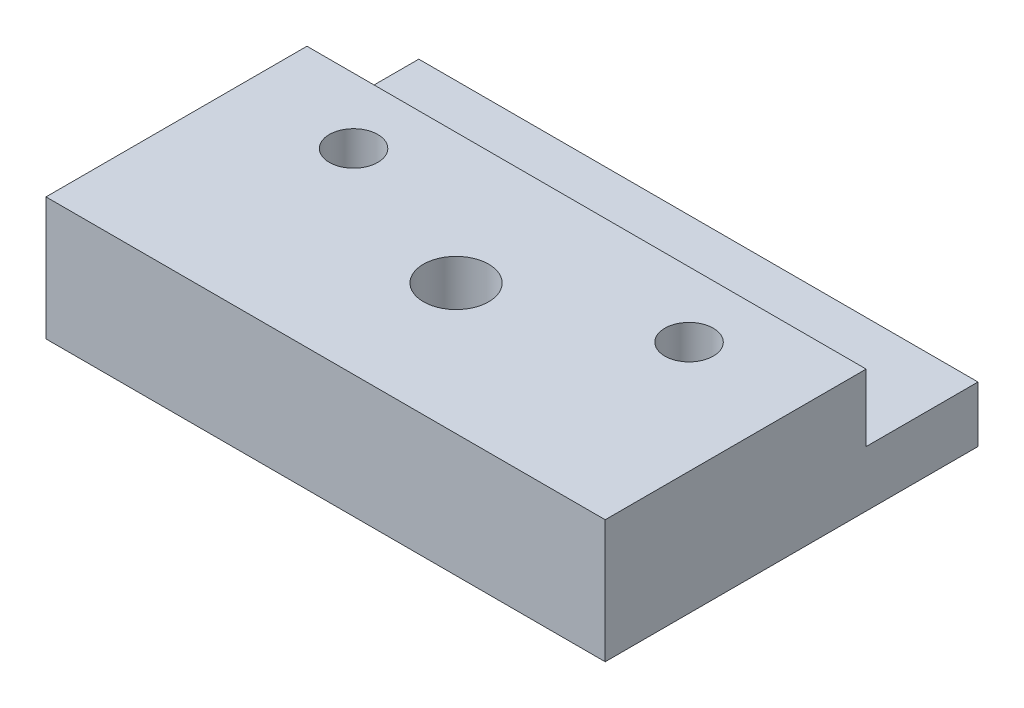
ISO-10303-21;
HEADER;
FILE_DESCRIPTION(('STEP AP214'),'2;1');
FILE_NAME('part.step','',(''),(''),'','','');
FILE_SCHEMA(('AUTOMOTIVE_DESIGN { 1 0 10303 214 1 1 1 1 }'));
ENDSEC;
DATA;
#1=APPLICATION_CONTEXT('core data for automotive mechanical design processes');
#2=APPLICATION_PROTOCOL_DEFINITION('international standard','automotive_design',2000,#1);
#3=PRODUCT_CONTEXT('',#1,'mechanical');
#4=PRODUCT('Part','Part','',(#3));
#5=PRODUCT_RELATED_PRODUCT_CATEGORY('part','',(#4));
#6=PRODUCT_DEFINITION_FORMATION('','',#4);
#7=PRODUCT_DEFINITION_CONTEXT('part definition',#1,'design');
#8=PRODUCT_DEFINITION('design','',#6,#7);
#9=PRODUCT_DEFINITION_SHAPE('','',#8);
#10=(LENGTH_UNIT() NAMED_UNIT(*) SI_UNIT(.MILLI.,.METRE.));
#11=(NAMED_UNIT(*) PLANE_ANGLE_UNIT() SI_UNIT($,.RADIAN.));
#12=(NAMED_UNIT(*) SI_UNIT($,.STERADIAN.) SOLID_ANGLE_UNIT());
#13=UNCERTAINTY_MEASURE_WITH_UNIT(LENGTH_MEASURE(1.E-05),#10,'distance_accuracy_value','');
#14=(GEOMETRIC_REPRESENTATION_CONTEXT(3) GLOBAL_UNCERTAINTY_ASSIGNED_CONTEXT((#13)) GLOBAL_UNIT_ASSIGNED_CONTEXT((#10,
#11,#12)) REPRESENTATION_CONTEXT('',''));
#15=CARTESIAN_POINT('',(0.,0.,0.));
#16=DIRECTION('',(0.,0.,1.));
#17=DIRECTION('',(1.,0.,0.));
#18=AXIS2_PLACEMENT_3D('',#15,#16,#17);
#19=CARTESIAN_POINT('',(0.,3.,0.));
#20=DIRECTION('',(0.,-1.,0.));
#21=DIRECTION('',(0.,0.,-1.));
#22=AXIS2_PLACEMENT_3D('',#19,#20,#21);
#23=PLANE('',#22);
#24=DIRECTION('',(-1.,0.,0.));
#25=VECTOR('',#24,1.);
#26=CARTESIAN_POINT('',(0.,3.,-14.));
#27=LINE('',#26,#25);
#28=CARTESIAN_POINT('',(30.,3.,-14.));
#29=VERTEX_POINT('',#28);
#30=CARTESIAN_POINT('',(0.,3.,-14.));
#31=VERTEX_POINT('',#30);
#32=EDGE_CURVE('E52',#29,#31,#27,.T.);
#33=ORIENTED_EDGE('',*,*,#32,.F.);
#34=DIRECTION('',(0.,0.,-1.));
#35=VECTOR('',#34,1.);
#36=CARTESIAN_POINT('',(30.,3.,0.));
#37=LINE('',#36,#35);
#38=CARTESIAN_POINT('',(30.,3.,-20.));
#39=VERTEX_POINT('',#38);
#40=EDGE_CURVE('E112',#29,#39,#37,.T.);
#41=ORIENTED_EDGE('',*,*,#40,.T.);
#42=DIRECTION('',(-1.,0.,0.));
#43=VECTOR('',#42,1.);
#44=CARTESIAN_POINT('',(0.,3.,-20.));
#45=LINE('',#44,#43);
#46=CARTESIAN_POINT('',(0.,3.,-20.));
#47=VERTEX_POINT('',#46);
#48=EDGE_CURVE('E58',#39,#47,#45,.T.);
#49=ORIENTED_EDGE('',*,*,#48,.T.);
#50=DIRECTION('',(0.,0.,1.));
#51=VECTOR('',#50,1.);
#52=CARTESIAN_POINT('',(0.,3.,0.));
#53=LINE('',#52,#51);
#54=EDGE_CURVE('E87',#47,#31,#53,.T.);
#55=ORIENTED_EDGE('',*,*,#54,.T.);
#56=EDGE_LOOP('',(#33,#41,#49,#55));
#57=FACE_BOUND('',#56,.T.);
#58=ADVANCED_FACE('F35',(#57),#23,.F.);
#59=CARTESIAN_POINT('',(0.,3.,0.));
#60=DIRECTION('',(1.,0.,0.));
#61=DIRECTION('',(0.,0.,-1.));
#62=AXIS2_PLACEMENT_3D('',#59,#60,#61);
#63=PLANE('',#62);
#64=DIRECTION('',(0.,0.,1.));
#65=VECTOR('',#64,1.);
#66=CARTESIAN_POINT('',(0.,0.,0.));
#67=LINE('',#66,#65);
#68=CARTESIAN_POINT('',(0.,0.,-20.));
#69=VERTEX_POINT('',#68);
#70=CARTESIAN_POINT('',(0.,0.,0.));
#71=VERTEX_POINT('',#70);
#72=EDGE_CURVE('E93',#69,#71,#67,.T.);
#73=ORIENTED_EDGE('',*,*,#72,.T.);
#74=DIRECTION('',(0.,-1.,0.));
#75=VECTOR('',#74,1.);
#76=CARTESIAN_POINT('',(0.,3.,0.));
#77=LINE('',#76,#75);
#78=CARTESIAN_POINT('',(0.,6.6,0.));
#79=VERTEX_POINT('',#78);
#80=EDGE_CURVE('E11',#79,#71,#77,.T.);
#81=ORIENTED_EDGE('',*,*,#80,.F.);
#82=DIRECTION('',(0.,0.,1.));
#83=VECTOR('',#82,1.);
#84=CARTESIAN_POINT('',(0.,6.6,0.));
#85=LINE('',#84,#83);
#86=CARTESIAN_POINT('',(0.,6.6,-14.));
#87=VERTEX_POINT('',#86);
#88=EDGE_CURVE('E122',#87,#79,#85,.T.);
#89=ORIENTED_EDGE('',*,*,#88,.F.);
#90=DIRECTION('',(0.,-1.,0.));
#91=VECTOR('',#90,1.);
#92=CARTESIAN_POINT('',(0.,6.6,-14.));
#93=LINE('',#92,#91);
#94=EDGE_CURVE('E102',#87,#31,#93,.T.);
#95=ORIENTED_EDGE('',*,*,#94,.T.);
#96=ORIENTED_EDGE('',*,*,#54,.F.);
#97=DIRECTION('',(0.,-1.,0.));
#98=VECTOR('',#97,1.);
#99=CARTESIAN_POINT('',(0.,3.,-20.));
#100=LINE('',#99,#98);
#101=EDGE_CURVE('E80',#47,#69,#100,.T.);
#102=ORIENTED_EDGE('',*,*,#101,.T.);
#103=EDGE_LOOP('',(#73,#81,#89,#95,#96,#102));
#104=FACE_BOUND('',#103,.T.);
#105=ADVANCED_FACE('F37',(#104),#63,.F.);
#106=CARTESIAN_POINT('',(0.,3.,0.));
#107=DIRECTION('',(0.,0.,-1.));
#108=DIRECTION('',(-1.,0.,0.));
#109=AXIS2_PLACEMENT_3D('',#106,#107,#108);
#110=PLANE('',#109);
#111=DIRECTION('',(1.,0.,0.));
#112=VECTOR('',#111,1.);
#113=CARTESIAN_POINT('',(0.,0.,0.));
#114=LINE('',#113,#112);
#115=CARTESIAN_POINT('',(30.,0.,0.));
#116=VERTEX_POINT('',#115);
#117=EDGE_CURVE('E97',#71,#116,#114,.T.);
#118=ORIENTED_EDGE('',*,*,#117,.T.);
#119=DIRECTION('',(0.,-1.,0.));
#120=VECTOR('',#119,1.);
#121=CARTESIAN_POINT('',(30.,3.,0.));
#122=LINE('',#121,#120);
#123=CARTESIAN_POINT('',(30.,6.6,0.));
#124=VERTEX_POINT('',#123);
#125=EDGE_CURVE('E44',#124,#116,#122,.T.);
#126=ORIENTED_EDGE('',*,*,#125,.F.);
#127=DIRECTION('',(1.,0.,0.));
#128=VECTOR('',#127,1.);
#129=CARTESIAN_POINT('',(0.,6.6,0.));
#130=LINE('',#129,#128);
#131=EDGE_CURVE('E135',#79,#124,#130,.T.);
#132=ORIENTED_EDGE('',*,*,#131,.F.);
#133=ORIENTED_EDGE('',*,*,#80,.T.);
#134=EDGE_LOOP('',(#118,#126,#132,#133));
#135=FACE_BOUND('',#134,.T.);
#136=ADVANCED_FACE('F184',(#135),#110,.F.);
#137=CARTESIAN_POINT('',(30.,3.,0.));
#138=DIRECTION('',(-1.,0.,0.));
#139=DIRECTION('',(0.,0.,1.));
#140=AXIS2_PLACEMENT_3D('',#137,#138,#139);
#141=PLANE('',#140);
#142=DIRECTION('',(0.,0.,-1.));
#143=VECTOR('',#142,1.);
#144=CARTESIAN_POINT('',(30.,0.,0.));
#145=LINE('',#144,#143);
#146=CARTESIAN_POINT('',(30.,0.,-20.));
#147=VERTEX_POINT('',#146);
#148=EDGE_CURVE('E88',#116,#147,#145,.T.);
#149=ORIENTED_EDGE('',*,*,#148,.T.);
#150=DIRECTION('',(0.,-1.,0.));
#151=VECTOR('',#150,1.);
#152=CARTESIAN_POINT('',(30.,3.,-20.));
#153=LINE('',#152,#151);
#154=EDGE_CURVE('E83',#39,#147,#153,.T.);
#155=ORIENTED_EDGE('',*,*,#154,.F.);
#156=ORIENTED_EDGE('',*,*,#40,.F.);
#157=DIRECTION('',(0.,-1.,0.));
#158=VECTOR('',#157,1.);
#159=CARTESIAN_POINT('',(30.,6.6,-14.));
#160=LINE('',#159,#158);
#161=CARTESIAN_POINT('',(30.,6.6,-14.));
#162=VERTEX_POINT('',#161);
#163=EDGE_CURVE('E98',#162,#29,#160,.T.);
#164=ORIENTED_EDGE('',*,*,#163,.F.);
#165=DIRECTION('',(0.,0.,-1.));
#166=VECTOR('',#165,1.);
#167=CARTESIAN_POINT('',(30.,6.6,0.));
#168=LINE('',#167,#166);
#169=EDGE_CURVE('E130',#124,#162,#168,.T.);
#170=ORIENTED_EDGE('',*,*,#169,.F.);
#171=ORIENTED_EDGE('',*,*,#125,.T.);
#172=EDGE_LOOP('',(#149,#155,#156,#164,#170,#171));
#173=FACE_BOUND('',#172,.T.);
#174=ADVANCED_FACE('F181',(#173),#141,.F.);
#175=CARTESIAN_POINT('',(0.,3.,-20.));
#176=DIRECTION('',(0.,0.,1.));
#177=DIRECTION('',(1.,0.,0.));
#178=AXIS2_PLACEMENT_3D('',#175,#176,#177);
#179=PLANE('',#178);
#180=DIRECTION('',(-1.,0.,0.));
#181=VECTOR('',#180,1.);
#182=CARTESIAN_POINT('',(0.,0.,-20.));
#183=LINE('',#182,#181);
#184=EDGE_CURVE('E77',#147,#69,#183,.T.);
#185=ORIENTED_EDGE('',*,*,#184,.T.);
#186=ORIENTED_EDGE('',*,*,#101,.F.);
#187=ORIENTED_EDGE('',*,*,#48,.F.);
#188=ORIENTED_EDGE('',*,*,#154,.T.);
#189=EDGE_LOOP('',(#185,#186,#187,#188));
#190=FACE_BOUND('',#189,.T.);
#191=ADVANCED_FACE('F79',(#190),#179,.F.);
#192=CARTESIAN_POINT('',(0.,0.,0.));
#193=DIRECTION('',(0.,-1.,0.));
#194=DIRECTION('',(0.,0.,-1.));
#195=AXIS2_PLACEMENT_3D('',#192,#193,#194);
#196=PLANE('',#195);
#197=CARTESIAN_POINT('',(15.,0.,-7.));
#198=DIRECTION('',(0.,1.,0.));
#199=DIRECTION('',(0.,0.,1.));
#200=AXIS2_PLACEMENT_3D('',#197,#198,#199);
#201=CIRCLE('',#200,1.74999999999999);
#202=CARTESIAN_POINT('',(15.,0.,-5.25000000000001));
#203=VERTEX_POINT('',#202);
#204=EDGE_CURVE('E154',#203,#203,#201,.T.);
#205=ORIENTED_EDGE('',*,*,#204,.T.);
#206=EDGE_LOOP('',(#205));
#207=FACE_BOUND('',#206,.T.);
#208=CARTESIAN_POINT('',(6.,0.,-10.5));
#209=DIRECTION('',(0.,1.,0.));
#210=DIRECTION('',(0.,0.,1.));
#211=AXIS2_PLACEMENT_3D('',#208,#209,#210);
#212=CIRCLE('',#211,1.3);
#213=CARTESIAN_POINT('',(6.,0.,-9.2));
#214=VERTEX_POINT('',#213);
#215=EDGE_CURVE('E148',#214,#214,#212,.T.);
#216=ORIENTED_EDGE('',*,*,#215,.T.);
#217=EDGE_LOOP('',(#216));
#218=FACE_BOUND('',#217,.T.);
#219=CARTESIAN_POINT('',(24.,0.,-10.5));
#220=DIRECTION('',(0.,1.,0.));
#221=DIRECTION('',(0.,0.,1.));
#222=AXIS2_PLACEMENT_3D('',#219,#220,#221);
#223=CIRCLE('',#222,1.3);
#224=CARTESIAN_POINT('',(24.,0.,-9.2));
#225=VERTEX_POINT('',#224);
#226=EDGE_CURVE('E123',#225,#225,#223,.T.);
#227=ORIENTED_EDGE('',*,*,#226,.T.);
#228=EDGE_LOOP('',(#227));
#229=FACE_BOUND('',#228,.T.);
#230=ORIENTED_EDGE('',*,*,#72,.F.);
#231=ORIENTED_EDGE('',*,*,#184,.F.);
#232=ORIENTED_EDGE('',*,*,#148,.F.);
#233=ORIENTED_EDGE('',*,*,#117,.F.);
#234=EDGE_LOOP('',(#230,#231,#232,#233));
#235=FACE_BOUND('',#234,.T.);
#236=ADVANCED_FACE('F96',(#207,#218,#229,#235),#196,.T.);
#237=CARTESIAN_POINT('',(0.,6.6,-14.));
#238=DIRECTION('',(0.,0.,1.));
#239=DIRECTION('',(1.,0.,0.));
#240=AXIS2_PLACEMENT_3D('',#237,#238,#239);
#241=PLANE('',#240);
#242=ORIENTED_EDGE('',*,*,#32,.T.);
#243=ORIENTED_EDGE('',*,*,#94,.F.);
#244=DIRECTION('',(-1.,0.,0.));
#245=VECTOR('',#244,1.);
#246=CARTESIAN_POINT('',(0.,6.6,-14.));
#247=LINE('',#246,#245);
#248=EDGE_CURVE('E119',#162,#87,#247,.T.);
#249=ORIENTED_EDGE('',*,*,#248,.F.);
#250=ORIENTED_EDGE('',*,*,#163,.T.);
#251=EDGE_LOOP('',(#242,#243,#249,#250));
#252=FACE_BOUND('',#251,.T.);
#253=ADVANCED_FACE('F167',(#252),#241,.F.);
#254=CARTESIAN_POINT('',(0.,6.6,0.));
#255=DIRECTION('',(0.,-1.,0.));
#256=DIRECTION('',(0.,0.,-1.));
#257=AXIS2_PLACEMENT_3D('',#254,#255,#256);
#258=PLANE('',#257);
#259=CARTESIAN_POINT('',(15.,6.6,-7.));
#260=DIRECTION('',(0.,1.,0.));
#261=DIRECTION('',(0.,0.,1.));
#262=AXIS2_PLACEMENT_3D('',#259,#260,#261);
#263=CIRCLE('',#262,1.74999999999999);
#264=CARTESIAN_POINT('',(15.,6.6,-5.25000000000001));
#265=VERTEX_POINT('',#264);
#266=EDGE_CURVE('E157',#265,#265,#263,.T.);
#267=ORIENTED_EDGE('',*,*,#266,.F.);
#268=EDGE_LOOP('',(#267));
#269=FACE_BOUND('',#268,.T.);
#270=CARTESIAN_POINT('',(6.,6.6,-10.5));
#271=DIRECTION('',(0.,1.,0.));
#272=DIRECTION('',(0.,0.,1.));
#273=AXIS2_PLACEMENT_3D('',#270,#271,#272);
#274=CIRCLE('',#273,1.3);
#275=CARTESIAN_POINT('',(6.,6.6,-9.2));
#276=VERTEX_POINT('',#275);
#277=EDGE_CURVE('E151',#276,#276,#274,.T.);
#278=ORIENTED_EDGE('',*,*,#277,.F.);
#279=EDGE_LOOP('',(#278));
#280=FACE_BOUND('',#279,.T.);
#281=CARTESIAN_POINT('',(24.,6.6,-10.5));
#282=DIRECTION('',(0.,1.,0.));
#283=DIRECTION('',(0.,0.,1.));
#284=AXIS2_PLACEMENT_3D('',#281,#282,#283);
#285=CIRCLE('',#284,1.3);
#286=CARTESIAN_POINT('',(24.,6.6,-9.2));
#287=VERTEX_POINT('',#286);
#288=EDGE_CURVE('E145',#287,#287,#285,.T.);
#289=ORIENTED_EDGE('',*,*,#288,.F.);
#290=EDGE_LOOP('',(#289));
#291=FACE_BOUND('',#290,.T.);
#292=ORIENTED_EDGE('',*,*,#88,.T.);
#293=ORIENTED_EDGE('',*,*,#131,.T.);
#294=ORIENTED_EDGE('',*,*,#169,.T.);
#295=ORIENTED_EDGE('',*,*,#248,.T.);
#296=EDGE_LOOP('',(#292,#293,#294,#295));
#297=FACE_BOUND('',#296,.T.);
#298=ADVANCED_FACE('F163',(#269,#280,#291,#297),#258,.F.);
#299=CARTESIAN_POINT('',(24.,6.6,-10.5));
#300=DIRECTION('',(0.,1.,0.));
#301=DIRECTION('',(0.,0.,1.));
#302=AXIS2_PLACEMENT_3D('',#299,#300,#301);
#303=CYLINDRICAL_SURFACE('',#302,1.3);
#304=ORIENTED_EDGE('',*,*,#226,.F.);
#305=EDGE_LOOP('',(#304));
#306=FACE_BOUND('',#305,.T.);
#307=ORIENTED_EDGE('',*,*,#288,.T.);
#308=EDGE_LOOP('',(#307));
#309=FACE_BOUND('',#308,.T.);
#310=ADVANCED_FACE('F166',(#306,#309),#303,.F.);
#311=CARTESIAN_POINT('',(6.,6.6,-10.5));
#312=DIRECTION('',(0.,1.,0.));
#313=DIRECTION('',(0.,0.,1.));
#314=AXIS2_PLACEMENT_3D('',#311,#312,#313);
#315=CYLINDRICAL_SURFACE('',#314,1.3);
#316=ORIENTED_EDGE('',*,*,#215,.F.);
#317=EDGE_LOOP('',(#316));
#318=FACE_BOUND('',#317,.T.);
#319=ORIENTED_EDGE('',*,*,#277,.T.);
#320=EDGE_LOOP('',(#319));
#321=FACE_BOUND('',#320,.T.);
#322=ADVANCED_FACE('F226',(#318,#321),#315,.F.);
#323=CARTESIAN_POINT('',(15.,6.6,-7.));
#324=DIRECTION('',(0.,1.,0.));
#325=DIRECTION('',(0.,0.,1.));
#326=AXIS2_PLACEMENT_3D('',#323,#324,#325);
#327=CYLINDRICAL_SURFACE('',#326,1.74999999999999);
#328=ORIENTED_EDGE('',*,*,#204,.F.);
#329=EDGE_LOOP('',(#328));
#330=FACE_BOUND('',#329,.T.);
#331=ORIENTED_EDGE('',*,*,#266,.T.);
#332=EDGE_LOOP('',(#331));
#333=FACE_BOUND('',#332,.T.);
#334=ADVANCED_FACE('F161',(#330,#333),#327,.F.);
#335=CLOSED_SHELL('',(#58,#105,#136,#174,#191,#236,#253,#298,#310,#322,#334));
#336=MANIFOLD_SOLID_BREP('B2',#335);
#337=ADVANCED_BREP_SHAPE_REPRESENTATION('',(#18,#336),#14);
#338=SHAPE_DEFINITION_REPRESENTATION(#9,#337);
ENDSEC;
END-ISO-10303-21;
